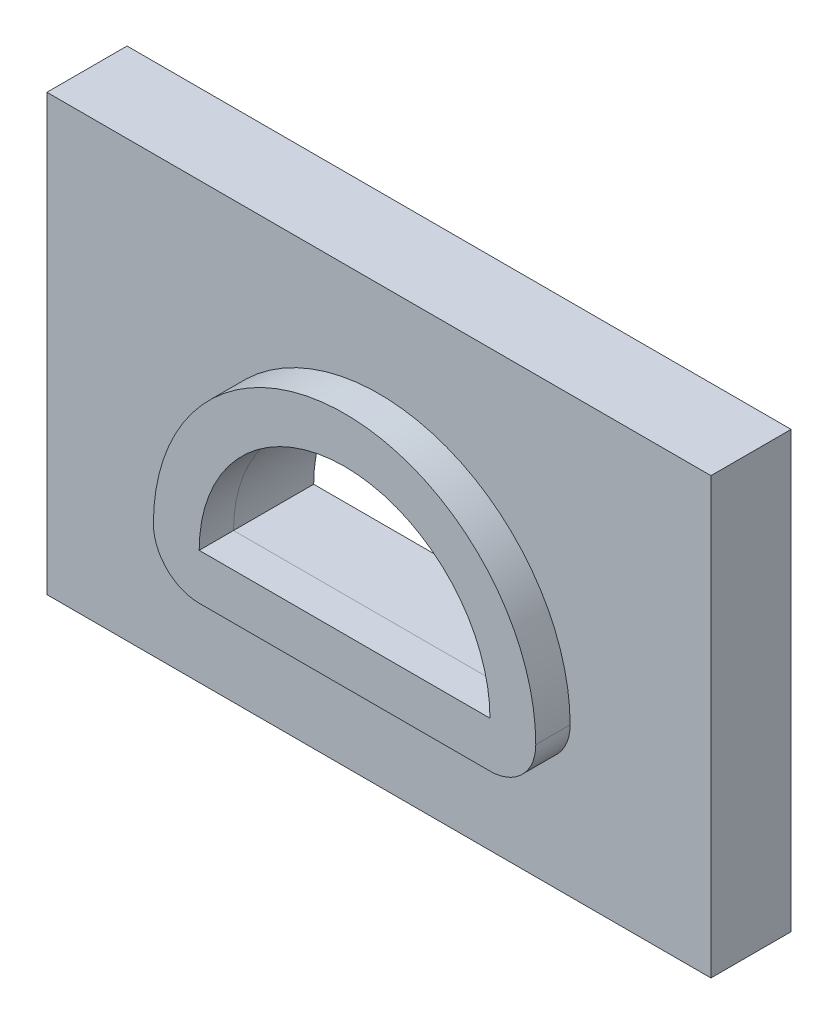
ISO-10303-21;
HEADER;
FILE_DESCRIPTION(('STEP AP214'),'2;1');
FILE_NAME('part.step','',(''),(''),'','','');
FILE_SCHEMA(('AUTOMOTIVE_DESIGN { 1 0 10303 214 1 1 1 1 }'));
ENDSEC;
DATA;
#1=APPLICATION_CONTEXT('core data for automotive mechanical design processes');
#2=APPLICATION_PROTOCOL_DEFINITION('international standard','automotive_design',2000,#1);
#3=PRODUCT_CONTEXT('',#1,'mechanical');
#4=PRODUCT('Part','Part','',(#3));
#5=PRODUCT_RELATED_PRODUCT_CATEGORY('part','',(#4));
#6=PRODUCT_DEFINITION_FORMATION('','',#4);
#7=PRODUCT_DEFINITION_CONTEXT('part definition',#1,'design');
#8=PRODUCT_DEFINITION('design','',#6,#7);
#9=PRODUCT_DEFINITION_SHAPE('','',#8);
#10=(LENGTH_UNIT() NAMED_UNIT(*) SI_UNIT(.MILLI.,.METRE.));
#11=(NAMED_UNIT(*) PLANE_ANGLE_UNIT() SI_UNIT($,.RADIAN.));
#12=(NAMED_UNIT(*) SI_UNIT($,.STERADIAN.) SOLID_ANGLE_UNIT());
#13=UNCERTAINTY_MEASURE_WITH_UNIT(LENGTH_MEASURE(1.E-05),#10,'distance_accuracy_value','');
#14=(GEOMETRIC_REPRESENTATION_CONTEXT(3) GLOBAL_UNCERTAINTY_ASSIGNED_CONTEXT((#13)) GLOBAL_UNIT_ASSIGNED_CONTEXT((#10,
#11,#12)) REPRESENTATION_CONTEXT('',''));
#15=CARTESIAN_POINT('',(0.,0.,0.));
#16=DIRECTION('',(0.,0.,1.));
#17=DIRECTION('',(1.,0.,0.));
#18=AXIS2_PLACEMENT_3D('',#15,#16,#17);
#19=CARTESIAN_POINT('',(2.15,0.,-3.5));
#20=DIRECTION('',(0.,0.,1.));
#21=DIRECTION('',(1.,0.,0.));
#22=AXIS2_PLACEMENT_3D('',#19,#20,#21);
#23=CYLINDRICAL_SURFACE('',#22,6.35);
#24=CARTESIAN_POINT('',(2.15,0.,0.));
#25=DIRECTION('',(0.,0.,1.));
#26=DIRECTION('',(1.,0.,0.));
#27=AXIS2_PLACEMENT_3D('',#24,#25,#26);
#28=CIRCLE('',#27,6.35);
#29=CARTESIAN_POINT('',(8.5,0.,0.));
#30=VERTEX_POINT('',#29);
#31=CARTESIAN_POINT('',(-4.2,0.,0.));
#32=VERTEX_POINT('',#31);
#33=EDGE_CURVE('E140',#30,#32,#28,.T.);
#34=ORIENTED_EDGE('',*,*,#33,.T.);
#35=DIRECTION('',(0.,0.,1.));
#36=VECTOR('',#35,1.);
#37=CARTESIAN_POINT('',(-4.2,0.,-3.5));
#38=LINE('',#37,#36);
#39=CARTESIAN_POINT('',(-4.2,0.,-3.5));
#40=VERTEX_POINT('',#39);
#41=EDGE_CURVE('E12',#40,#32,#38,.T.);
#42=ORIENTED_EDGE('',*,*,#41,.F.);
#43=CARTESIAN_POINT('',(2.15,0.,-3.5));
#44=DIRECTION('',(0.,0.,1.));
#45=DIRECTION('',(1.,0.,0.));
#46=AXIS2_PLACEMENT_3D('',#43,#44,#45);
#47=CIRCLE('',#46,6.35);
#48=CARTESIAN_POINT('',(8.5,0.,-3.5));
#49=VERTEX_POINT('',#48);
#50=EDGE_CURVE('E124',#49,#40,#47,.T.);
#51=ORIENTED_EDGE('',*,*,#50,.F.);
#52=DIRECTION('',(0.,0.,1.));
#53=VECTOR('',#52,1.);
#54=CARTESIAN_POINT('',(8.5,0.,-3.5));
#55=LINE('',#54,#53);
#56=EDGE_CURVE('E55',#49,#30,#55,.T.);
#57=ORIENTED_EDGE('',*,*,#56,.T.);
#58=EDGE_LOOP('',(#34,#42,#51,#57));
#59=FACE_BOUND('',#58,.T.);
#60=ADVANCED_FACE('F45',(#59),#23,.F.);
#61=CARTESIAN_POINT('',(16.65,0.,-3.5));
#62=DIRECTION('',(-1.,0.,0.));
#63=DIRECTION('',(0.,-1.,0.));
#64=AXIS2_PLACEMENT_3D('',#61,#62,#63);
#65=PLANE('',#64);
#66=DIRECTION('',(0.,-1.,0.));
#67=VECTOR('',#66,1.);
#68=CARTESIAN_POINT('',(16.65,0.,0.));
#69=LINE('',#68,#67);
#70=CARTESIAN_POINT('',(16.65,12.5,0.));
#71=VERTEX_POINT('',#70);
#72=CARTESIAN_POINT('',(16.65,-6.5,0.));
#73=VERTEX_POINT('',#72);
#74=EDGE_CURVE('E116',#71,#73,#69,.T.);
#75=ORIENTED_EDGE('',*,*,#74,.T.);
#76=DIRECTION('',(0.,0.,1.));
#77=VECTOR('',#76,1.);
#78=CARTESIAN_POINT('',(16.65,-6.5,-3.5));
#79=LINE('',#78,#77);
#80=CARTESIAN_POINT('',(16.65,-6.5,-3.5));
#81=VERTEX_POINT('',#80);
#82=EDGE_CURVE('E114',#81,#73,#79,.T.);
#83=ORIENTED_EDGE('',*,*,#82,.F.);
#84=DIRECTION('',(0.,-1.,0.));
#85=VECTOR('',#84,1.);
#86=CARTESIAN_POINT('',(16.65,0.,-3.5));
#87=LINE('',#86,#85);
#88=CARTESIAN_POINT('',(16.65,12.5,-3.5));
#89=VERTEX_POINT('',#88);
#90=EDGE_CURVE('E104',#89,#81,#87,.T.);
#91=ORIENTED_EDGE('',*,*,#90,.F.);
#92=DIRECTION('',(0.,0.,1.));
#93=VECTOR('',#92,1.);
#94=CARTESIAN_POINT('',(16.65,12.5,-3.5));
#95=LINE('',#94,#93);
#96=EDGE_CURVE('E49',#89,#71,#95,.T.);
#97=ORIENTED_EDGE('',*,*,#96,.T.);
#98=EDGE_LOOP('',(#75,#83,#91,#97));
#99=FACE_BOUND('',#98,.T.);
#100=ADVANCED_FACE('F47',(#99),#65,.F.);
#101=CARTESIAN_POINT('',(0.,-6.5,-3.5));
#102=DIRECTION('',(0.,-1.,0.));
#103=DIRECTION('',(1.,0.,0.));
#104=AXIS2_PLACEMENT_3D('',#101,#102,#103);
#105=PLANE('',#104);
#106=DIRECTION('',(1.,0.,0.));
#107=VECTOR('',#106,1.);
#108=CARTESIAN_POINT('',(0.,-6.5,0.));
#109=LINE('',#108,#107);
#110=CARTESIAN_POINT('',(-12.35,-6.5,0.));
#111=VERTEX_POINT('',#110);
#112=EDGE_CURVE('E138',#111,#73,#109,.T.);
#113=ORIENTED_EDGE('',*,*,#112,.F.);
#114=DIRECTION('',(0.,0.,1.));
#115=VECTOR('',#114,1.);
#116=CARTESIAN_POINT('',(-12.35,-6.5,-3.5));
#117=LINE('',#116,#115);
#118=CARTESIAN_POINT('',(-12.35,-6.5,-3.5));
#119=VERTEX_POINT('',#118);
#120=EDGE_CURVE('E120',#119,#111,#117,.T.);
#121=ORIENTED_EDGE('',*,*,#120,.F.);
#122=DIRECTION('',(1.,0.,0.));
#123=VECTOR('',#122,1.);
#124=CARTESIAN_POINT('',(0.,-6.5,-3.5));
#125=LINE('',#124,#123);
#126=EDGE_CURVE('E109',#119,#81,#125,.T.);
#127=ORIENTED_EDGE('',*,*,#126,.T.);
#128=ORIENTED_EDGE('',*,*,#82,.T.);
#129=EDGE_LOOP('',(#113,#121,#127,#128));
#130=FACE_BOUND('',#129,.T.);
#131=ADVANCED_FACE('F122',(#130),#105,.T.);
#132=CARTESIAN_POINT('',(-12.35,0.,-3.5));
#133=DIRECTION('',(-1.,0.,0.));
#134=DIRECTION('',(0.,-1.,0.));
#135=AXIS2_PLACEMENT_3D('',#132,#133,#134);
#136=PLANE('',#135);
#137=DIRECTION('',(0.,-1.,0.));
#138=VECTOR('',#137,1.);
#139=CARTESIAN_POINT('',(-12.35,0.,0.));
#140=LINE('',#139,#138);
#141=CARTESIAN_POINT('',(-12.35,12.5,0.));
#142=VERTEX_POINT('',#141);
#143=EDGE_CURVE('E135',#142,#111,#140,.T.);
#144=ORIENTED_EDGE('',*,*,#143,.F.);
#145=DIRECTION('',(0.,0.,1.));
#146=VECTOR('',#145,1.);
#147=CARTESIAN_POINT('',(-12.35,12.5,-3.5));
#148=LINE('',#147,#146);
#149=CARTESIAN_POINT('',(-12.35,12.5,-3.5));
#150=VERTEX_POINT('',#149);
#151=EDGE_CURVE('E145',#150,#142,#148,.T.);
#152=ORIENTED_EDGE('',*,*,#151,.F.);
#153=DIRECTION('',(0.,-1.,0.));
#154=VECTOR('',#153,1.);
#155=CARTESIAN_POINT('',(-12.35,0.,-3.5));
#156=LINE('',#155,#154);
#157=EDGE_CURVE('E125',#150,#119,#156,.T.);
#158=ORIENTED_EDGE('',*,*,#157,.T.);
#159=ORIENTED_EDGE('',*,*,#120,.T.);
#160=EDGE_LOOP('',(#144,#152,#158,#159));
#161=FACE_BOUND('',#160,.T.);
#162=ADVANCED_FACE('F152',(#161),#136,.T.);
#163=CARTESIAN_POINT('',(0.,12.5,-3.5));
#164=DIRECTION('',(0.,-1.,0.));
#165=DIRECTION('',(0.,0.,-1.));
#166=AXIS2_PLACEMENT_3D('',#163,#164,#165);
#167=PLANE('',#166);
#168=DIRECTION('',(1.,0.,0.));
#169=VECTOR('',#168,1.);
#170=CARTESIAN_POINT('',(0.,12.5,0.));
#171=LINE('',#170,#169);
#172=EDGE_CURVE('E133',#142,#71,#171,.T.);
#173=ORIENTED_EDGE('',*,*,#172,.T.);
#174=ORIENTED_EDGE('',*,*,#96,.F.);
#175=DIRECTION('',(1.,0.,0.));
#176=VECTOR('',#175,1.);
#177=CARTESIAN_POINT('',(0.,12.5,-3.5));
#178=LINE('',#177,#176);
#179=EDGE_CURVE('E95',#150,#89,#178,.T.);
#180=ORIENTED_EDGE('',*,*,#179,.F.);
#181=ORIENTED_EDGE('',*,*,#151,.T.);
#182=EDGE_LOOP('',(#173,#174,#180,#181));
#183=FACE_BOUND('',#182,.T.);
#184=ADVANCED_FACE('F153',(#183),#167,.F.);
#185=CARTESIAN_POINT('',(0.,0.,-3.5));
#186=DIRECTION('',(0.,-1.,0.));
#187=DIRECTION('',(0.,0.,-1.));
#188=AXIS2_PLACEMENT_3D('',#185,#186,#187);
#189=PLANE('',#188);
#190=DIRECTION('',(1.,0.,0.));
#191=VECTOR('',#190,1.);
#192=CARTESIAN_POINT('',(0.,0.,0.));
#193=LINE('',#192,#191);
#194=EDGE_CURVE('E83',#32,#30,#193,.T.);
#195=ORIENTED_EDGE('',*,*,#194,.T.);
#196=ORIENTED_EDGE('',*,*,#56,.F.);
#197=DIRECTION('',(1.,0.,0.));
#198=VECTOR('',#197,1.);
#199=CARTESIAN_POINT('',(0.,0.,-3.5));
#200=LINE('',#199,#198);
#201=EDGE_CURVE('E63',#40,#49,#200,.T.);
#202=ORIENTED_EDGE('',*,*,#201,.F.);
#203=ORIENTED_EDGE('',*,*,#41,.T.);
#204=EDGE_LOOP('',(#195,#196,#202,#203));
#205=FACE_BOUND('',#204,.T.);
#206=ADVANCED_FACE('F155',(#205),#189,.F.);
#207=CARTESIAN_POINT('',(0.,0.,-3.5));
#208=DIRECTION('',(0.,0.,1.));
#209=DIRECTION('',(1.,0.,0.));
#210=AXIS2_PLACEMENT_3D('',#207,#208,#209);
#211=PLANE('',#210);
#212=ORIENTED_EDGE('',*,*,#90,.T.);
#213=ORIENTED_EDGE('',*,*,#126,.F.);
#214=ORIENTED_EDGE('',*,*,#157,.F.);
#215=ORIENTED_EDGE('',*,*,#179,.T.);
#216=EDGE_LOOP('',(#212,#213,#214,#215));
#217=FACE_BOUND('',#216,.T.);
#218=ORIENTED_EDGE('',*,*,#50,.T.);
#219=ORIENTED_EDGE('',*,*,#201,.T.);
#220=EDGE_LOOP('',(#218,#219));
#221=FACE_BOUND('',#220,.T.);
#222=ADVANCED_FACE('F106',(#217,#221),#211,.F.);
#223=CARTESIAN_POINT('',(0.,0.,0.));
#224=DIRECTION('',(0.,0.,1.));
#225=DIRECTION('',(1.,0.,0.));
#226=AXIS2_PLACEMENT_3D('',#223,#224,#225);
#227=PLANE('',#226);
#228=ORIENTED_EDGE('',*,*,#74,.F.);
#229=ORIENTED_EDGE('',*,*,#172,.F.);
#230=ORIENTED_EDGE('',*,*,#143,.T.);
#231=ORIENTED_EDGE('',*,*,#112,.T.);
#232=EDGE_LOOP('',(#228,#229,#230,#231));
#233=FACE_BOUND('',#232,.T.);
#234=ORIENTED_EDGE('',*,*,#33,.F.);
#235=ORIENTED_EDGE('',*,*,#194,.F.);
#236=EDGE_LOOP('',(#234,#235));
#237=FACE_BOUND('',#236,.T.);
#238=ADVANCED_FACE('F149',(#233,#237),#227,.T.);
#239=CLOSED_SHELL('',(#60,#100,#131,#162,#184,#206,#222,#238));
#240=MANIFOLD_SOLID_BREP('B2',#239);
#241=CARTESIAN_POINT('',(2.15,0.,1.5));
#242=DIRECTION('',(0.,0.,-1.));
#243=DIRECTION('',(-1.,0.,0.));
#244=AXIS2_PLACEMENT_3D('',#241,#242,#243);
#245=CYLINDRICAL_SURFACE('',#244,8.35);
#246=CARTESIAN_POINT('',(2.15,0.,0.));
#247=DIRECTION('',(0.,0.,1.));
#248=DIRECTION('',(1.,0.,0.));
#249=AXIS2_PLACEMENT_3D('',#246,#247,#248);
#250=CIRCLE('',#249,8.35);
#251=CARTESIAN_POINT('',(10.5,0.,0.));
#252=VERTEX_POINT('',#251);
#253=CARTESIAN_POINT('',(-6.2,0.,0.));
#254=VERTEX_POINT('',#253);
#255=EDGE_CURVE('E310',#252,#254,#250,.T.);
#256=ORIENTED_EDGE('',*,*,#255,.T.);
#257=DIRECTION('',(0.,0.,-1.));
#258=VECTOR('',#257,1.);
#259=CARTESIAN_POINT('',(-6.2,0.,1.5));
#260=LINE('',#259,#258);
#261=CARTESIAN_POINT('',(-6.2,0.,1.5));
#262=VERTEX_POINT('',#261);
#263=EDGE_CURVE('E292',#262,#254,#260,.T.);
#264=ORIENTED_EDGE('',*,*,#263,.F.);
#265=CARTESIAN_POINT('',(2.15,0.,1.5));
#266=DIRECTION('',(0.,0.,1.));
#267=DIRECTION('',(1.,0.,0.));
#268=AXIS2_PLACEMENT_3D('',#265,#266,#267);
#269=CIRCLE('',#268,8.35);
#270=CARTESIAN_POINT('',(10.5,0.,1.5));
#271=VERTEX_POINT('',#270);
#272=EDGE_CURVE('E301',#271,#262,#269,.T.);
#273=ORIENTED_EDGE('',*,*,#272,.F.);
#274=DIRECTION('',(0.,0.,-1.));
#275=VECTOR('',#274,1.);
#276=CARTESIAN_POINT('',(10.5,0.,1.5));
#277=LINE('',#276,#275);
#278=EDGE_CURVE('E316',#271,#252,#277,.T.);
#279=ORIENTED_EDGE('',*,*,#278,.T.);
#280=EDGE_LOOP('',(#256,#264,#273,#279));
#281=FACE_BOUND('',#280,.T.);
#282=ADVANCED_FACE('F229',(#281),#245,.T.);
#283=CARTESIAN_POINT('',(2.15,0.,1.5));
#284=DIRECTION('',(0.,0.,-1.));
#285=DIRECTION('',(-1.,0.,0.));
#286=AXIS2_PLACEMENT_3D('',#283,#284,#285);
#287=CYLINDRICAL_SURFACE('',#286,6.35);
#288=CARTESIAN_POINT('',(2.15,0.,0.));
#289=DIRECTION('',(0.,0.,1.));
#290=DIRECTION('',(1.,0.,0.));
#291=AXIS2_PLACEMENT_3D('',#288,#289,#290);
#292=CIRCLE('',#291,6.35);
#293=CARTESIAN_POINT('',(8.5,0.,0.));
#294=VERTEX_POINT('',#293);
#295=CARTESIAN_POINT('',(-4.2,0.,0.));
#296=VERTEX_POINT('',#295);
#297=EDGE_CURVE('E287',#294,#296,#292,.T.);
#298=ORIENTED_EDGE('',*,*,#297,.F.);
#299=DIRECTION('',(0.,0.,-1.));
#300=VECTOR('',#299,1.);
#301=CARTESIAN_POINT('',(8.5,0.,1.5));
#302=LINE('',#301,#300);
#303=CARTESIAN_POINT('',(8.5,0.,1.5));
#304=VERTEX_POINT('',#303);
#305=EDGE_CURVE('E281',#304,#294,#302,.T.);
#306=ORIENTED_EDGE('',*,*,#305,.F.);
#307=CARTESIAN_POINT('',(2.15,0.,1.5));
#308=DIRECTION('',(0.,0.,1.));
#309=DIRECTION('',(1.,0.,0.));
#310=AXIS2_PLACEMENT_3D('',#307,#308,#309);
#311=CIRCLE('',#310,6.35);
#312=CARTESIAN_POINT('',(-4.2,0.,1.5));
#313=VERTEX_POINT('',#312);
#314=EDGE_CURVE('E284',#304,#313,#311,.T.);
#315=ORIENTED_EDGE('',*,*,#314,.T.);
#316=DIRECTION('',(0.,0.,-1.));
#317=VECTOR('',#316,1.);
#318=CARTESIAN_POINT('',(-4.2,0.,1.5));
#319=LINE('',#318,#317);
#320=EDGE_CURVE('E293',#313,#296,#319,.T.);
#321=ORIENTED_EDGE('',*,*,#320,.T.);
#322=EDGE_LOOP('',(#298,#306,#315,#321));
#323=FACE_BOUND('',#322,.T.);
#324=ADVANCED_FACE('F283',(#323),#287,.F.);
#325=CARTESIAN_POINT('',(0.,0.,1.5));
#326=DIRECTION('',(0.,1.,0.));
#327=DIRECTION('',(0.,0.,1.));
#328=AXIS2_PLACEMENT_3D('',#325,#326,#327);
#329=PLANE('',#328);
#330=DIRECTION('',(1.,0.,0.));
#331=VECTOR('',#330,1.);
#332=CARTESIAN_POINT('',(0.,0.,0.));
#333=LINE('',#332,#331);
#334=EDGE_CURVE('E308',#296,#294,#333,.T.);
#335=ORIENTED_EDGE('',*,*,#334,.F.);
#336=ORIENTED_EDGE('',*,*,#320,.F.);
#337=DIRECTION('',(1.,0.,0.));
#338=VECTOR('',#337,1.);
#339=CARTESIAN_POINT('',(0.,0.,1.5));
#340=LINE('',#339,#338);
#341=EDGE_CURVE('E297',#313,#304,#340,.T.);
#342=ORIENTED_EDGE('',*,*,#341,.T.);
#343=ORIENTED_EDGE('',*,*,#305,.T.);
#344=EDGE_LOOP('',(#335,#336,#342,#343));
#345=FACE_BOUND('',#344,.T.);
#346=ADVANCED_FACE('F300',(#345),#329,.T.);
#347=CARTESIAN_POINT('',(0.,-2.,1.5));
#348=DIRECTION('',(0.,1.,0.));
#349=DIRECTION('',(0.,0.,1.));
#350=AXIS2_PLACEMENT_3D('',#347,#348,#349);
#351=PLANE('',#350);
#352=DIRECTION('',(1.,0.,0.));
#353=VECTOR('',#352,1.);
#354=CARTESIAN_POINT('',(0.,-2.,1.5));
#355=LINE('',#354,#353);
#356=CARTESIAN_POINT('',(-4.2,-2.,1.5));
#357=VERTEX_POINT('',#356);
#358=CARTESIAN_POINT('',(8.5,-2.,1.5));
#359=VERTEX_POINT('',#358);
#360=EDGE_CURVE('E303',#357,#359,#355,.T.);
#361=ORIENTED_EDGE('',*,*,#360,.F.);
#362=DIRECTION('',(0.,0.,-1.));
#363=VECTOR('',#362,1.);
#364=CARTESIAN_POINT('',(-4.2,-2.,1.5));
#365=LINE('',#364,#363);
#366=CARTESIAN_POINT('',(-4.2,-2.,0.));
#367=VERTEX_POINT('',#366);
#368=EDGE_CURVE('E321',#357,#367,#365,.T.);
#369=ORIENTED_EDGE('',*,*,#368,.T.);
#370=DIRECTION('',(1.,0.,0.));
#371=VECTOR('',#370,1.);
#372=CARTESIAN_POINT('',(0.,-2.,0.));
#373=LINE('',#372,#371);
#374=CARTESIAN_POINT('',(8.5,-2.,0.));
#375=VERTEX_POINT('',#374);
#376=EDGE_CURVE('E298',#367,#375,#373,.T.);
#377=ORIENTED_EDGE('',*,*,#376,.T.);
#378=DIRECTION('',(0.,0.,-1.));
#379=VECTOR('',#378,1.);
#380=CARTESIAN_POINT('',(8.5,-2.,1.5));
#381=LINE('',#380,#379);
#382=EDGE_CURVE('E244',#375,#359,#381,.F.);
#383=ORIENTED_EDGE('',*,*,#382,.T.);
#384=EDGE_LOOP('',(#361,#369,#377,#383));
#385=FACE_BOUND('',#384,.T.);
#386=ADVANCED_FACE('F340',(#385),#351,.F.);
#387=CARTESIAN_POINT('',(0.,0.,1.5));
#388=DIRECTION('',(0.,0.,1.));
#389=DIRECTION('',(1.,0.,0.));
#390=AXIS2_PLACEMENT_3D('',#387,#388,#389);
#391=PLANE('',#390);
#392=ORIENTED_EDGE('',*,*,#314,.F.);
#393=ORIENTED_EDGE('',*,*,#341,.F.);
#394=EDGE_LOOP('',(#392,#393));
#395=FACE_BOUND('',#394,.T.);
#396=ORIENTED_EDGE('',*,*,#272,.T.);
#397=CARTESIAN_POINT('',(-4.2,0.,1.5));
#398=DIRECTION('',(0.,0.,1.));
#399=DIRECTION('',(1.,0.,0.));
#400=AXIS2_PLACEMENT_3D('',#397,#398,#399);
#401=CIRCLE('',#400,2.);
#402=EDGE_CURVE('E43',#262,#357,#401,.T.);
#403=ORIENTED_EDGE('',*,*,#402,.T.);
#404=ORIENTED_EDGE('',*,*,#360,.T.);
#405=CARTESIAN_POINT('',(8.5,0.,1.5));
#406=DIRECTION('',(0.,0.,1.));
#407=DIRECTION('',(1.,0.,0.));
#408=AXIS2_PLACEMENT_3D('',#405,#406,#407);
#409=CIRCLE('',#408,2.);
#410=EDGE_CURVE('E237',#359,#271,#409,.T.);
#411=ORIENTED_EDGE('',*,*,#410,.T.);
#412=EDGE_LOOP('',(#396,#403,#404,#411));
#413=FACE_BOUND('',#412,.T.);
#414=ADVANCED_FACE('F296',(#395,#413),#391,.T.);
#415=CARTESIAN_POINT('',(0.,0.,0.));
#416=DIRECTION('',(0.,0.,1.));
#417=DIRECTION('',(1.,0.,0.));
#418=AXIS2_PLACEMENT_3D('',#415,#416,#417);
#419=PLANE('',#418);
#420=ORIENTED_EDGE('',*,*,#297,.T.);
#421=ORIENTED_EDGE('',*,*,#334,.T.);
#422=EDGE_LOOP('',(#420,#421));
#423=FACE_BOUND('',#422,.T.);
#424=ORIENTED_EDGE('',*,*,#376,.F.);
#425=CARTESIAN_POINT('',(-4.2,0.,0.));
#426=DIRECTION('',(0.,0.,1.));
#427=DIRECTION('',(1.,0.,0.));
#428=AXIS2_PLACEMENT_3D('',#425,#426,#427);
#429=CIRCLE('',#428,2.);
#430=EDGE_CURVE('E326',#367,#254,#429,.F.);
#431=ORIENTED_EDGE('',*,*,#430,.T.);
#432=ORIENTED_EDGE('',*,*,#255,.F.);
#433=CARTESIAN_POINT('',(8.5,0.,0.));
#434=DIRECTION('',(0.,0.,1.));
#435=DIRECTION('',(1.,0.,0.));
#436=AXIS2_PLACEMENT_3D('',#433,#434,#435);
#437=CIRCLE('',#436,2.);
#438=EDGE_CURVE('E324',#252,#375,#437,.F.);
#439=ORIENTED_EDGE('',*,*,#438,.T.);
#440=EDGE_LOOP('',(#424,#431,#432,#439));
#441=FACE_BOUND('',#440,.T.);
#442=ADVANCED_FACE('F336',(#423,#441),#419,.F.);
#443=CARTESIAN_POINT('',(-4.2,0.,1.5));
#444=DIRECTION('',(0.,0.,-1.));
#445=DIRECTION('',(-1.,0.,0.));
#446=AXIS2_PLACEMENT_3D('',#443,#444,#445);
#447=CYLINDRICAL_SURFACE('',#446,2.);
#448=ORIENTED_EDGE('',*,*,#402,.F.);
#449=ORIENTED_EDGE('',*,*,#263,.T.);
#450=ORIENTED_EDGE('',*,*,#430,.F.);
#451=ORIENTED_EDGE('',*,*,#368,.F.);
#452=EDGE_LOOP('',(#448,#449,#450,#451));
#453=FACE_BOUND('',#452,.T.);
#454=ADVANCED_FACE('F338',(#453),#447,.T.);
#455=CARTESIAN_POINT('',(8.5,0.,1.5));
#456=DIRECTION('',(0.,0.,-1.));
#457=DIRECTION('',(-1.,0.,0.));
#458=AXIS2_PLACEMENT_3D('',#455,#456,#457);
#459=CYLINDRICAL_SURFACE('',#458,2.);
#460=ORIENTED_EDGE('',*,*,#410,.F.);
#461=ORIENTED_EDGE('',*,*,#382,.F.);
#462=ORIENTED_EDGE('',*,*,#438,.F.);
#463=ORIENTED_EDGE('',*,*,#278,.F.);
#464=EDGE_LOOP('',(#460,#461,#462,#463));
#465=FACE_BOUND('',#464,.T.);
#466=ADVANCED_FACE('F231',(#465),#459,.T.);
#467=CLOSED_SHELL('',(#282,#324,#346,#386,#414,#442,#454,#466));
#468=MANIFOLD_SOLID_BREP('B6',#467);
#469=ADVANCED_BREP_SHAPE_REPRESENTATION('',(#18,#240,#468),#14);
#470=SHAPE_DEFINITION_REPRESENTATION(#9,#469);
ENDSEC;
END-ISO-10303-21;
